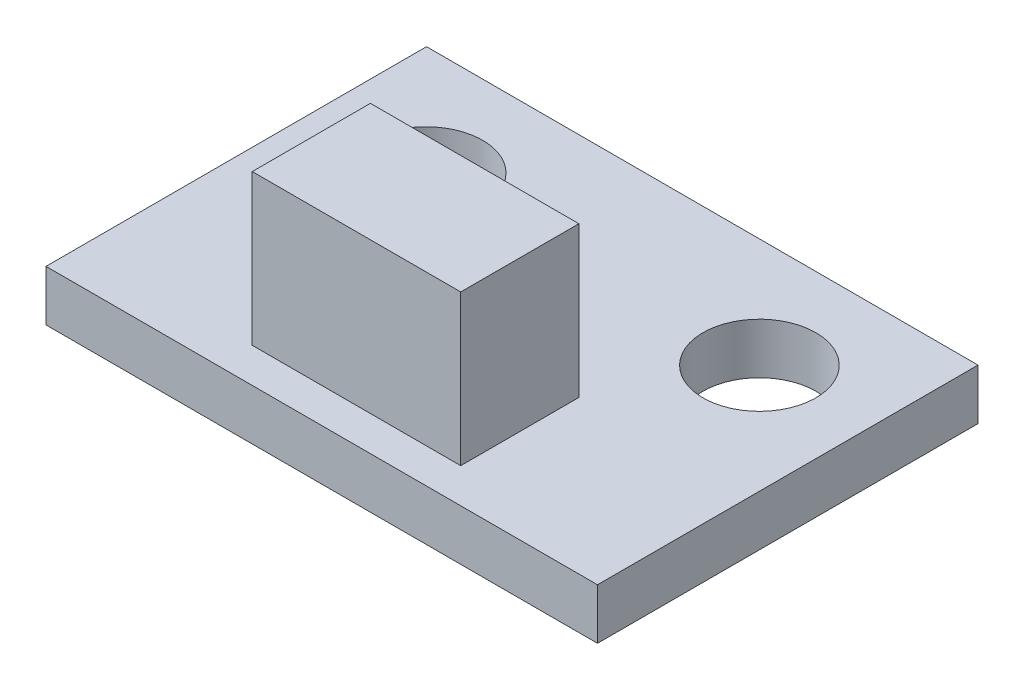
ISO-10303-21;
HEADER;
FILE_DESCRIPTION(('STEP AP214'),'2;1');
FILE_NAME('part.step','',(''),(''),'','','');
FILE_SCHEMA(('AUTOMOTIVE_DESIGN { 1 0 10303 214 1 1 1 1 }'));
ENDSEC;
DATA;
#1=APPLICATION_CONTEXT('core data for automotive mechanical design processes');
#2=APPLICATION_PROTOCOL_DEFINITION('international standard','automotive_design',2000,#1);
#3=PRODUCT_CONTEXT('',#1,'mechanical');
#4=PRODUCT('Part','Part','',(#3));
#5=PRODUCT_RELATED_PRODUCT_CATEGORY('part','',(#4));
#6=PRODUCT_DEFINITION_FORMATION('','',#4);
#7=PRODUCT_DEFINITION_CONTEXT('part definition',#1,'design');
#8=PRODUCT_DEFINITION('design','',#6,#7);
#9=PRODUCT_DEFINITION_SHAPE('','',#8);
#10=(LENGTH_UNIT() NAMED_UNIT(*) SI_UNIT(.MILLI.,.METRE.));
#11=(NAMED_UNIT(*) PLANE_ANGLE_UNIT() SI_UNIT($,.RADIAN.));
#12=(NAMED_UNIT(*) SI_UNIT($,.STERADIAN.) SOLID_ANGLE_UNIT());
#13=UNCERTAINTY_MEASURE_WITH_UNIT(LENGTH_MEASURE(1.E-05),#10,'distance_accuracy_value','');
#14=(GEOMETRIC_REPRESENTATION_CONTEXT(3) GLOBAL_UNCERTAINTY_ASSIGNED_CONTEXT((#13)) GLOBAL_UNIT_ASSIGNED_CONTEXT((#10,
#11,#12)) REPRESENTATION_CONTEXT('',''));
#15=CARTESIAN_POINT('',(0.,0.,0.));
#16=DIRECTION('',(0.,0.,1.));
#17=DIRECTION('',(1.,0.,0.));
#18=AXIS2_PLACEMENT_3D('',#15,#16,#17);
#19=CARTESIAN_POINT('',(0.,1.46,0.));
#20=DIRECTION('',(0.,-1.,0.));
#21=DIRECTION('',(0.,0.,-1.));
#22=AXIS2_PLACEMENT_3D('',#19,#20,#21);
#23=PLANE('',#22);
#24=CARTESIAN_POINT('',(4.795,1.46,-2.32499999999999));
#25=DIRECTION('',(0.,1.,0.));
#26=DIRECTION('',(0.,0.,-1.));
#27=AXIS2_PLACEMENT_3D('',#24,#25,#26);
#28=CIRCLE('',#27,1.625);
#29=CARTESIAN_POINT('',(4.795,1.46,-3.94999999999998));
#30=VERTEX_POINT('',#29);
#31=EDGE_CURVE('E121',#30,#30,#28,.T.);
#32=ORIENTED_EDGE('',*,*,#31,.F.);
#33=EDGE_LOOP('',(#32));
#34=FACE_BOUND('',#33,.T.);
#35=CARTESIAN_POINT('',(-4.795,1.46,-2.32499999999999));
#36=DIRECTION('',(0.,1.,0.));
#37=DIRECTION('',(0.,0.,1.));
#38=AXIS2_PLACEMENT_3D('',#35,#36,#37);
#39=CIRCLE('',#38,1.625);
#40=CARTESIAN_POINT('',(-4.795,1.46,-0.699999999999985));
#41=VERTEX_POINT('',#40);
#42=EDGE_CURVE('E130',#41,#41,#39,.T.);
#43=ORIENTED_EDGE('',*,*,#42,.F.);
#44=EDGE_LOOP('',(#43));
#45=FACE_BOUND('',#44,.T.);
#46=DIRECTION('',(0.,0.,1.));
#47=VECTOR('',#46,1.);
#48=CARTESIAN_POINT('',(-7.935,1.46,-5.47499999999999));
#49=LINE('',#48,#47);
#50=CARTESIAN_POINT('',(-7.935,1.46,-5.47499999999999));
#51=VERTEX_POINT('',#50);
#52=CARTESIAN_POINT('',(-7.935,1.46,5.47500000000001));
#53=VERTEX_POINT('',#52);
#54=EDGE_CURVE('E136',#51,#53,#49,.T.);
#55=ORIENTED_EDGE('',*,*,#54,.T.);
#56=DIRECTION('',(1.,0.,0.));
#57=VECTOR('',#56,1.);
#58=CARTESIAN_POINT('',(7.935,1.46,5.47500000000002));
#59=LINE('',#58,#57);
#60=CARTESIAN_POINT('',(7.935,1.46,5.47500000000002));
#61=VERTEX_POINT('',#60);
#62=EDGE_CURVE('E139',#53,#61,#59,.T.);
#63=ORIENTED_EDGE('',*,*,#62,.T.);
#64=DIRECTION('',(0.,0.,-1.));
#65=VECTOR('',#64,1.);
#66=CARTESIAN_POINT('',(7.935,1.46,-5.47499999999999));
#67=LINE('',#66,#65);
#68=CARTESIAN_POINT('',(7.935,1.46,-5.47499999999999));
#69=VERTEX_POINT('',#68);
#70=EDGE_CURVE('E142',#61,#69,#67,.T.);
#71=ORIENTED_EDGE('',*,*,#70,.T.);
#72=DIRECTION('',(-1.,0.,0.));
#73=VECTOR('',#72,1.);
#74=CARTESIAN_POINT('',(7.935,1.46,-5.47499999999999));
#75=LINE('',#74,#73);
#76=EDGE_CURVE('E144',#69,#51,#75,.T.);
#77=ORIENTED_EDGE('',*,*,#76,.T.);
#78=EDGE_LOOP('',(#55,#63,#71,#77));
#79=FACE_BOUND('',#78,.T.);
#80=DIRECTION('',(0.,0.,1.));
#81=VECTOR('',#80,1.);
#82=CARTESIAN_POINT('',(-3.,1.46,1.07500000000001));
#83=LINE('',#82,#81);
#84=CARTESIAN_POINT('',(-3.,1.46,1.07500000000001));
#85=VERTEX_POINT('',#84);
#86=CARTESIAN_POINT('',(-3.,1.46,4.47500000000001));
#87=VERTEX_POINT('',#86);
#88=EDGE_CURVE('E117',#85,#87,#83,.T.);
#89=ORIENTED_EDGE('',*,*,#88,.F.);
#90=DIRECTION('',(-1.,0.,0.));
#91=VECTOR('',#90,1.);
#92=CARTESIAN_POINT('',(-3.,1.46,1.07500000000001));
#93=LINE('',#92,#91);
#94=CARTESIAN_POINT('',(3.,1.46,1.07500000000001));
#95=VERTEX_POINT('',#94);
#96=EDGE_CURVE('E114',#95,#85,#93,.T.);
#97=ORIENTED_EDGE('',*,*,#96,.F.);
#98=DIRECTION('',(0.,0.,-1.));
#99=VECTOR('',#98,1.);
#100=CARTESIAN_POINT('',(3.,1.46,1.07500000000001));
#101=LINE('',#100,#99);
#102=CARTESIAN_POINT('',(3.,1.46,4.47500000000001));
#103=VERTEX_POINT('',#102);
#104=EDGE_CURVE('E52',#103,#95,#101,.T.);
#105=ORIENTED_EDGE('',*,*,#104,.F.);
#106=DIRECTION('',(1.,0.,0.));
#107=VECTOR('',#106,1.);
#108=CARTESIAN_POINT('',(-3.,1.46,4.47500000000001));
#109=LINE('',#108,#107);
#110=EDGE_CURVE('E47',#87,#103,#109,.T.);
#111=ORIENTED_EDGE('',*,*,#110,.F.);
#112=EDGE_LOOP('',(#89,#97,#105,#111));
#113=FACE_BOUND('',#112,.T.);
#114=ADVANCED_FACE('F32',(#34,#45,#79,#113),#23,.F.);
#115=CARTESIAN_POINT('',(0.,0.,0.));
#116=DIRECTION('',(0.,-1.,0.));
#117=DIRECTION('',(0.,0.,-1.));
#118=AXIS2_PLACEMENT_3D('',#115,#116,#117);
#119=PLANE('',#118);
#120=CARTESIAN_POINT('',(-4.795,0.,-2.32499999999999));
#121=DIRECTION('',(0.,1.,0.));
#122=DIRECTION('',(0.,0.,1.));
#123=AXIS2_PLACEMENT_3D('',#120,#121,#122);
#124=CIRCLE('',#123,1.625);
#125=CARTESIAN_POINT('',(-4.795,0.,-0.699999999999985));
#126=VERTEX_POINT('',#125);
#127=EDGE_CURVE('E128',#126,#126,#124,.T.);
#128=ORIENTED_EDGE('',*,*,#127,.T.);
#129=EDGE_LOOP('',(#128));
#130=FACE_BOUND('',#129,.T.);
#131=DIRECTION('',(0.,0.,1.));
#132=VECTOR('',#131,1.);
#133=CARTESIAN_POINT('',(-7.935,0.,-5.47499999999999));
#134=LINE('',#133,#132);
#135=CARTESIAN_POINT('',(-7.935,0.,-5.47499999999999));
#136=VERTEX_POINT('',#135);
#137=CARTESIAN_POINT('',(-7.935,0.,5.47500000000001));
#138=VERTEX_POINT('',#137);
#139=EDGE_CURVE('E133',#136,#138,#134,.T.);
#140=ORIENTED_EDGE('',*,*,#139,.F.);
#141=DIRECTION('',(-1.,0.,0.));
#142=VECTOR('',#141,1.);
#143=CARTESIAN_POINT('',(7.935,0.,-5.47499999999999));
#144=LINE('',#143,#142);
#145=CARTESIAN_POINT('',(7.935,0.,-5.47499999999999));
#146=VERTEX_POINT('',#145);
#147=EDGE_CURVE('E140',#146,#136,#144,.T.);
#148=ORIENTED_EDGE('',*,*,#147,.F.);
#149=DIRECTION('',(0.,0.,-1.));
#150=VECTOR('',#149,1.);
#151=CARTESIAN_POINT('',(7.935,0.,-5.47499999999999));
#152=LINE('',#151,#150);
#153=CARTESIAN_POINT('',(7.935,0.,5.47500000000002));
#154=VERTEX_POINT('',#153);
#155=EDGE_CURVE('E151',#154,#146,#152,.T.);
#156=ORIENTED_EDGE('',*,*,#155,.F.);
#157=DIRECTION('',(1.,0.,0.));
#158=VECTOR('',#157,1.);
#159=CARTESIAN_POINT('',(7.935,0.,5.47500000000002));
#160=LINE('',#159,#158);
#161=EDGE_CURVE('E149',#138,#154,#160,.T.);
#162=ORIENTED_EDGE('',*,*,#161,.F.);
#163=EDGE_LOOP('',(#140,#148,#156,#162));
#164=FACE_BOUND('',#163,.T.);
#165=CARTESIAN_POINT('',(4.795,0.,-2.32499999999999));
#166=DIRECTION('',(0.,1.,0.));
#167=DIRECTION('',(0.,0.,-1.));
#168=AXIS2_PLACEMENT_3D('',#165,#166,#167);
#169=CIRCLE('',#168,1.625);
#170=CARTESIAN_POINT('',(4.795,0.,-3.94999999999998));
#171=VERTEX_POINT('',#170);
#172=EDGE_CURVE('E118',#171,#171,#169,.T.);
#173=ORIENTED_EDGE('',*,*,#172,.T.);
#174=EDGE_LOOP('',(#173));
#175=FACE_BOUND('',#174,.T.);
#176=ADVANCED_FACE('F169',(#130,#164,#175),#119,.T.);
#177=CARTESIAN_POINT('',(-7.935,1.46,-5.47499999999999));
#178=DIRECTION('',(1.,0.,0.));
#179=DIRECTION('',(0.,0.,-1.));
#180=AXIS2_PLACEMENT_3D('',#177,#178,#179);
#181=PLANE('',#180);
#182=ORIENTED_EDGE('',*,*,#139,.T.);
#183=DIRECTION('',(0.,-1.,0.));
#184=VECTOR('',#183,1.);
#185=CARTESIAN_POINT('',(-7.935,1.46,5.47500000000001));
#186=LINE('',#185,#184);
#187=EDGE_CURVE('E11',#53,#138,#186,.T.);
#188=ORIENTED_EDGE('',*,*,#187,.F.);
#189=ORIENTED_EDGE('',*,*,#54,.F.);
#190=DIRECTION('',(0.,-1.,0.));
#191=VECTOR('',#190,1.);
#192=CARTESIAN_POINT('',(-7.935,1.46,-5.47499999999999));
#193=LINE('',#192,#191);
#194=EDGE_CURVE('E146',#51,#136,#193,.T.);
#195=ORIENTED_EDGE('',*,*,#194,.T.);
#196=EDGE_LOOP('',(#182,#188,#189,#195));
#197=FACE_BOUND('',#196,.T.);
#198=ADVANCED_FACE('F34',(#197),#181,.F.);
#199=CARTESIAN_POINT('',(7.935,1.46,5.47500000000002));
#200=DIRECTION('',(0.,0.,-1.));
#201=DIRECTION('',(-1.,0.,0.));
#202=AXIS2_PLACEMENT_3D('',#199,#200,#201);
#203=PLANE('',#202);
#204=ORIENTED_EDGE('',*,*,#161,.T.);
#205=DIRECTION('',(0.,-1.,0.));
#206=VECTOR('',#205,1.);
#207=CARTESIAN_POINT('',(7.935,1.46,5.47500000000002));
#208=LINE('',#207,#206);
#209=EDGE_CURVE('E40',#61,#154,#208,.T.);
#210=ORIENTED_EDGE('',*,*,#209,.F.);
#211=ORIENTED_EDGE('',*,*,#62,.F.);
#212=ORIENTED_EDGE('',*,*,#187,.T.);
#213=EDGE_LOOP('',(#204,#210,#211,#212));
#214=FACE_BOUND('',#213,.T.);
#215=ADVANCED_FACE('F179',(#214),#203,.F.);
#216=CARTESIAN_POINT('',(7.935,1.46,-5.47499999999999));
#217=DIRECTION('',(-1.,0.,0.));
#218=DIRECTION('',(0.,0.,1.));
#219=AXIS2_PLACEMENT_3D('',#216,#217,#218);
#220=PLANE('',#219);
#221=ORIENTED_EDGE('',*,*,#155,.T.);
#222=DIRECTION('',(0.,-1.,0.));
#223=VECTOR('',#222,1.);
#224=CARTESIAN_POINT('',(7.935,1.46,-5.47499999999999));
#225=LINE('',#224,#223);
#226=EDGE_CURVE('E156',#69,#146,#225,.T.);
#227=ORIENTED_EDGE('',*,*,#226,.F.);
#228=ORIENTED_EDGE('',*,*,#70,.F.);
#229=ORIENTED_EDGE('',*,*,#209,.T.);
#230=EDGE_LOOP('',(#221,#227,#228,#229));
#231=FACE_BOUND('',#230,.T.);
#232=ADVANCED_FACE('F163',(#231),#220,.F.);
#233=CARTESIAN_POINT('',(7.935,1.46,-5.47499999999999));
#234=DIRECTION('',(0.,0.,1.));
#235=DIRECTION('',(1.,0.,0.));
#236=AXIS2_PLACEMENT_3D('',#233,#234,#235);
#237=PLANE('',#236);
#238=ORIENTED_EDGE('',*,*,#147,.T.);
#239=ORIENTED_EDGE('',*,*,#194,.F.);
#240=ORIENTED_EDGE('',*,*,#76,.F.);
#241=ORIENTED_EDGE('',*,*,#226,.T.);
#242=EDGE_LOOP('',(#238,#239,#240,#241));
#243=FACE_BOUND('',#242,.T.);
#244=ADVANCED_FACE('F173',(#243),#237,.F.);
#245=CARTESIAN_POINT('',(-4.795,1.46,-2.32499999999999));
#246=DIRECTION('',(0.,-1.,0.));
#247=DIRECTION('',(0.,0.,-1.));
#248=AXIS2_PLACEMENT_3D('',#245,#246,#247);
#249=CYLINDRICAL_SURFACE('',#248,1.625);
#250=ORIENTED_EDGE('',*,*,#42,.T.);
#251=EDGE_LOOP('',(#250));
#252=FACE_BOUND('',#251,.T.);
#253=ORIENTED_EDGE('',*,*,#127,.F.);
#254=EDGE_LOOP('',(#253));
#255=FACE_BOUND('',#254,.T.);
#256=ADVANCED_FACE('F197',(#252,#255),#249,.F.);
#257=CARTESIAN_POINT('',(4.795,1.46,-2.32499999999999));
#258=DIRECTION('',(0.,-1.,0.));
#259=DIRECTION('',(0.,0.,-1.));
#260=AXIS2_PLACEMENT_3D('',#257,#258,#259);
#261=CYLINDRICAL_SURFACE('',#260,1.625);
#262=ORIENTED_EDGE('',*,*,#31,.T.);
#263=EDGE_LOOP('',(#262));
#264=FACE_BOUND('',#263,.T.);
#265=ORIENTED_EDGE('',*,*,#172,.F.);
#266=EDGE_LOOP('',(#265));
#267=FACE_BOUND('',#266,.T.);
#268=ADVANCED_FACE('F204',(#264,#267),#261,.F.);
#269=CARTESIAN_POINT('',(-3.,5.79,1.07500000000001));
#270=DIRECTION('',(1.,0.,0.));
#271=DIRECTION('',(0.,0.,-1.));
#272=AXIS2_PLACEMENT_3D('',#269,#270,#271);
#273=PLANE('',#272);
#274=ORIENTED_EDGE('',*,*,#88,.T.);
#275=DIRECTION('',(0.,-1.,0.));
#276=VECTOR('',#275,1.);
#277=CARTESIAN_POINT('',(-3.,5.79,4.47500000000001));
#278=LINE('',#277,#276);
#279=CARTESIAN_POINT('',(-3.,5.79,4.47500000000001));
#280=VERTEX_POINT('',#279);
#281=EDGE_CURVE('E98',#280,#87,#278,.T.);
#282=ORIENTED_EDGE('',*,*,#281,.F.);
#283=DIRECTION('',(0.,0.,1.));
#284=VECTOR('',#283,1.);
#285=CARTESIAN_POINT('',(-3.,5.79,1.07500000000001));
#286=LINE('',#285,#284);
#287=CARTESIAN_POINT('',(-3.,5.79,1.07500000000001));
#288=VERTEX_POINT('',#287);
#289=EDGE_CURVE('E105',#288,#280,#286,.T.);
#290=ORIENTED_EDGE('',*,*,#289,.F.);
#291=DIRECTION('',(0.,-1.,0.));
#292=VECTOR('',#291,1.);
#293=CARTESIAN_POINT('',(-3.,5.79,1.07500000000001));
#294=LINE('',#293,#292);
#295=EDGE_CURVE('E300',#288,#85,#294,.T.);
#296=ORIENTED_EDGE('',*,*,#295,.T.);
#297=EDGE_LOOP('',(#274,#282,#290,#296));
#298=FACE_BOUND('',#297,.T.);
#299=ADVANCED_FACE('F116',(#298),#273,.F.);
#300=CARTESIAN_POINT('',(-3.,5.79,4.47500000000001));
#301=DIRECTION('',(0.,0.,-1.));
#302=DIRECTION('',(-1.,0.,0.));
#303=AXIS2_PLACEMENT_3D('',#300,#301,#302);
#304=PLANE('',#303);
#305=ORIENTED_EDGE('',*,*,#110,.T.);
#306=DIRECTION('',(0.,-1.,0.));
#307=VECTOR('',#306,1.);
#308=CARTESIAN_POINT('',(3.,5.79,4.47500000000001));
#309=LINE('',#308,#307);
#310=CARTESIAN_POINT('',(3.,5.79,4.47500000000001));
#311=VERTEX_POINT('',#310);
#312=EDGE_CURVE('E101',#311,#103,#309,.T.);
#313=ORIENTED_EDGE('',*,*,#312,.F.);
#314=DIRECTION('',(1.,0.,0.));
#315=VECTOR('',#314,1.);
#316=CARTESIAN_POINT('',(-3.,5.79,4.47500000000001));
#317=LINE('',#316,#315);
#318=EDGE_CURVE('E94',#280,#311,#317,.T.);
#319=ORIENTED_EDGE('',*,*,#318,.F.);
#320=ORIENTED_EDGE('',*,*,#281,.T.);
#321=EDGE_LOOP('',(#305,#313,#319,#320));
#322=FACE_BOUND('',#321,.T.);
#323=ADVANCED_FACE('F96',(#322),#304,.F.);
#324=CARTESIAN_POINT('',(3.,5.79,1.07500000000001));
#325=DIRECTION('',(-1.,0.,0.));
#326=DIRECTION('',(0.,0.,1.));
#327=AXIS2_PLACEMENT_3D('',#324,#325,#326);
#328=PLANE('',#327);
#329=ORIENTED_EDGE('',*,*,#104,.T.);
#330=DIRECTION('',(0.,-1.,0.));
#331=VECTOR('',#330,1.);
#332=CARTESIAN_POINT('',(3.,5.79,1.07500000000001));
#333=LINE('',#332,#331);
#334=CARTESIAN_POINT('',(3.,5.79,1.07500000000001));
#335=VERTEX_POINT('',#334);
#336=EDGE_CURVE('E123',#335,#95,#333,.T.);
#337=ORIENTED_EDGE('',*,*,#336,.F.);
#338=DIRECTION('',(0.,0.,-1.));
#339=VECTOR('',#338,1.);
#340=CARTESIAN_POINT('',(3.,5.79,1.07500000000001));
#341=LINE('',#340,#339);
#342=EDGE_CURVE('E104',#311,#335,#341,.T.);
#343=ORIENTED_EDGE('',*,*,#342,.F.);
#344=ORIENTED_EDGE('',*,*,#312,.T.);
#345=EDGE_LOOP('',(#329,#337,#343,#344));
#346=FACE_BOUND('',#345,.T.);
#347=ADVANCED_FACE('F221',(#346),#328,.F.);
#348=CARTESIAN_POINT('',(-3.,5.79,1.07500000000001));
#349=DIRECTION('',(0.,0.,1.));
#350=DIRECTION('',(1.,0.,0.));
#351=AXIS2_PLACEMENT_3D('',#348,#349,#350);
#352=PLANE('',#351);
#353=ORIENTED_EDGE('',*,*,#96,.T.);
#354=ORIENTED_EDGE('',*,*,#295,.F.);
#355=DIRECTION('',(-1.,0.,0.));
#356=VECTOR('',#355,1.);
#357=CARTESIAN_POINT('',(-3.,5.79,1.07500000000001));
#358=LINE('',#357,#356);
#359=EDGE_CURVE('E110',#335,#288,#358,.T.);
#360=ORIENTED_EDGE('',*,*,#359,.F.);
#361=ORIENTED_EDGE('',*,*,#336,.T.);
#362=EDGE_LOOP('',(#353,#354,#360,#361));
#363=FACE_BOUND('',#362,.T.);
#364=ADVANCED_FACE('F224',(#363),#352,.F.);
#365=CARTESIAN_POINT('',(0.,5.79,0.));
#366=DIRECTION('',(0.,1.,0.));
#367=DIRECTION('',(0.,0.,1.));
#368=AXIS2_PLACEMENT_3D('',#365,#366,#367);
#369=PLANE('',#368);
#370=ORIENTED_EDGE('',*,*,#289,.T.);
#371=ORIENTED_EDGE('',*,*,#318,.T.);
#372=ORIENTED_EDGE('',*,*,#342,.T.);
#373=ORIENTED_EDGE('',*,*,#359,.T.);
#374=EDGE_LOOP('',(#370,#371,#372,#373));
#375=FACE_BOUND('',#374,.T.);
#376=ADVANCED_FACE('F108',(#375),#369,.T.);
#377=CLOSED_SHELL('',(#114,#176,#198,#215,#232,#244,#256,#268,#299,#323,#347,#364,#376));
#378=MANIFOLD_SOLID_BREP('B2',#377);
#379=ADVANCED_BREP_SHAPE_REPRESENTATION('',(#18,#378),#14);
#380=SHAPE_DEFINITION_REPRESENTATION(#9,#379);
ENDSEC;
END-ISO-10303-21;
